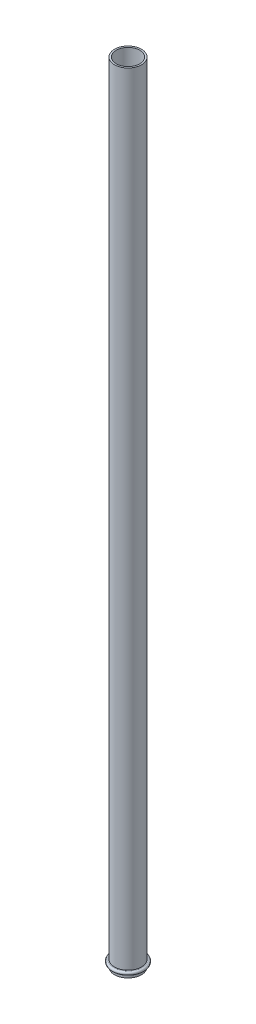
ISO-10303-21;
HEADER;
FILE_DESCRIPTION(('STEP AP214'),'2;1');
FILE_NAME('part.step','',(''),(''),'','','');
FILE_SCHEMA(('AUTOMOTIVE_DESIGN { 1 0 10303 214 1 1 1 1 }'));
ENDSEC;
DATA;
#1=APPLICATION_CONTEXT('core data for automotive mechanical design processes');
#2=APPLICATION_PROTOCOL_DEFINITION('international standard','automotive_design',2000,#1);
#3=PRODUCT_CONTEXT('',#1,'mechanical');
#4=PRODUCT('Part','Part','',(#3));
#5=PRODUCT_RELATED_PRODUCT_CATEGORY('part','',(#4));
#6=PRODUCT_DEFINITION_FORMATION('','',#4);
#7=PRODUCT_DEFINITION_CONTEXT('part definition',#1,'design');
#8=PRODUCT_DEFINITION('design','',#6,#7);
#9=PRODUCT_DEFINITION_SHAPE('','',#8);
#10=(LENGTH_UNIT() NAMED_UNIT(*) SI_UNIT(.MILLI.,.METRE.));
#11=(NAMED_UNIT(*) PLANE_ANGLE_UNIT() SI_UNIT($,.RADIAN.));
#12=(NAMED_UNIT(*) SI_UNIT($,.STERADIAN.) SOLID_ANGLE_UNIT());
#13=UNCERTAINTY_MEASURE_WITH_UNIT(LENGTH_MEASURE(1.E-05),#10,'distance_accuracy_value','');
#14=(GEOMETRIC_REPRESENTATION_CONTEXT(3) GLOBAL_UNCERTAINTY_ASSIGNED_CONTEXT((#13)) GLOBAL_UNIT_ASSIGNED_CONTEXT((#10,
#11,#12)) REPRESENTATION_CONTEXT('',''));
#15=CARTESIAN_POINT('',(0.,0.,0.));
#16=DIRECTION('',(0.,0.,1.));
#17=DIRECTION('',(1.,0.,0.));
#18=AXIS2_PLACEMENT_3D('',#15,#16,#17);
#19=CARTESIAN_POINT('',(0.,434.047675718833,0.));
#20=DIRECTION('',(0.,-1.,0.));
#21=DIRECTION('',(0.,0.,-1.));
#22=AXIS2_PLACEMENT_3D('',#19,#20,#21);
#23=CYLINDRICAL_SURFACE('',#22,6.85714285714286);
#24=CARTESIAN_POINT('',(0.,34.9105328616899,0.));
#25=DIRECTION('',(0.,-1.,0.));
#26=DIRECTION('',(0.,0.,-1.));
#27=AXIS2_PLACEMENT_3D('',#24,#25,#26);
#28=CIRCLE('',#27,6.85714285714286);
#29=CARTESIAN_POINT('',(0.,34.9105328616899,-6.85714285714287));
#30=VERTEX_POINT('',#29);
#31=EDGE_CURVE('E64',#30,#30,#28,.T.);
#32=ORIENTED_EDGE('',*,*,#31,.T.);
#33=EDGE_LOOP('',(#32));
#34=FACE_BOUND('',#33,.T.);
#35=CARTESIAN_POINT('',(0.,33.1962471474042,0.));
#36=DIRECTION('',(0.,1.,0.));
#37=DIRECTION('',(0.,0.,1.));
#38=AXIS2_PLACEMENT_3D('',#35,#36,#37);
#39=CIRCLE('',#38,6.85714285714286);
#40=CARTESIAN_POINT('',(0.,33.1962471474042,6.85714285714285));
#41=VERTEX_POINT('',#40);
#42=EDGE_CURVE('E52',#41,#41,#39,.T.);
#43=ORIENTED_EDGE('',*,*,#42,.T.);
#44=EDGE_LOOP('',(#43));
#45=FACE_BOUND('',#44,.T.);
#46=ADVANCED_FACE('F48',(#34,#45),#23,.T.);
#47=CARTESIAN_POINT('',(0.,434.047675718833,0.));
#48=DIRECTION('',(0.,1.,0.));
#49=DIRECTION('',(0.,0.,1.));
#50=AXIS2_PLACEMENT_3D('',#47,#48,#49);
#51=PLANE('',#50);
#52=CARTESIAN_POINT('',(0.,434.047675718833,0.));
#53=DIRECTION('',(0.,1.,0.));
#54=DIRECTION('',(0.,0.,1.));
#55=AXIS2_PLACEMENT_3D('',#52,#53,#54);
#56=CIRCLE('',#55,6.85714285714286);
#57=CARTESIAN_POINT('',(0.,434.047675718833,6.85714285714276));
#58=VERTEX_POINT('',#57);
#59=EDGE_CURVE('E12',#58,#58,#56,.T.);
#60=ORIENTED_EDGE('',*,*,#59,.T.);
#61=EDGE_LOOP('',(#60));
#62=FACE_BOUND('',#61,.T.);
#63=CARTESIAN_POINT('',(0.,434.047675718833,0.));
#64=DIRECTION('',(0.,1.,0.));
#65=DIRECTION('',(0.,0.,1.));
#66=AXIS2_PLACEMENT_3D('',#63,#64,#65);
#67=CIRCLE('',#66,6.);
#68=CARTESIAN_POINT('',(0.,434.047675718833,5.99999999999991));
#69=VERTEX_POINT('',#68);
#70=EDGE_CURVE('E59',#69,#69,#67,.T.);
#71=ORIENTED_EDGE('',*,*,#70,.F.);
#72=EDGE_LOOP('',(#71));
#73=FACE_BOUND('',#72,.T.);
#74=ADVANCED_FACE('F93',(#62,#73),#51,.T.);
#75=CARTESIAN_POINT('',(0.,33.1962471474042,0.));
#76=DIRECTION('',(0.,1.,0.));
#77=DIRECTION('',(0.,0.,1.));
#78=AXIS2_PLACEMENT_3D('',#75,#76,#77);
#79=PLANE('',#78);
#80=ORIENTED_EDGE('',*,*,#42,.F.);
#81=EDGE_LOOP('',(#80));
#82=FACE_BOUND('',#81,.T.);
#83=CARTESIAN_POINT('',(0.,33.1962471474042,0.));
#84=DIRECTION('',(0.,1.,0.));
#85=DIRECTION('',(0.,0.,1.));
#86=AXIS2_PLACEMENT_3D('',#83,#84,#85);
#87=CIRCLE('',#86,6.);
#88=CARTESIAN_POINT('',(0.,33.1962471474042,5.99999999999999));
#89=VERTEX_POINT('',#88);
#90=EDGE_CURVE('E61',#89,#89,#87,.T.);
#91=ORIENTED_EDGE('',*,*,#90,.T.);
#92=EDGE_LOOP('',(#91));
#93=FACE_BOUND('',#92,.T.);
#94=ADVANCED_FACE('F85',(#82,#93),#79,.F.);
#95=CARTESIAN_POINT('',(0.,36.6248185759756,0.));
#96=DIRECTION('',(0.,-1.,0.));
#97=DIRECTION('',(0.,0.,-1.));
#98=AXIS2_PLACEMENT_3D('',#95,#96,#97);
#99=CIRCLE('',#98,6.85714285714286);
#100=CARTESIAN_POINT('',(0.,36.6248185759756,-6.85714285714287));
#101=VERTEX_POINT('',#100);
#102=EDGE_CURVE('E75',#101,#101,#99,.T.);
#103=ORIENTED_EDGE('',*,*,#102,.F.);
#104=EDGE_LOOP('',(#103));
#105=FACE_BOUND('',#104,.T.);
#106=ORIENTED_EDGE('',*,*,#59,.F.);
#107=EDGE_LOOP('',(#106));
#108=FACE_BOUND('',#107,.T.);
#109=ADVANCED_FACE('F50',(#105,#108),#23,.T.);
#110=CARTESIAN_POINT('',(0.,434.047675718833,0.));
#111=DIRECTION('',(0.,-1.,0.));
#112=DIRECTION('',(0.,0.,-1.));
#113=AXIS2_PLACEMENT_3D('',#110,#111,#112);
#114=CYLINDRICAL_SURFACE('',#113,6.);
#115=ORIENTED_EDGE('',*,*,#70,.T.);
#116=EDGE_LOOP('',(#115));
#117=FACE_BOUND('',#116,.T.);
#118=ORIENTED_EDGE('',*,*,#90,.F.);
#119=EDGE_LOOP('',(#118));
#120=FACE_BOUND('',#119,.T.);
#121=ADVANCED_FACE('F84',(#117,#120),#114,.F.);
#122=CARTESIAN_POINT('',(6.85714285714285,34.9105328616899,0.));
#123=DIRECTION('',(0.,-1.,0.));
#124=DIRECTION('',(0.,0.,-1.));
#125=AXIS2_PLACEMENT_3D('',#122,#123,#124);
#126=PLANE('',#125);
#127=CARTESIAN_POINT('',(0.,34.9105328616899,0.));
#128=DIRECTION('',(0.,-1.,0.));
#129=DIRECTION('',(0.,0.,-1.));
#130=AXIS2_PLACEMENT_3D('',#127,#128,#129);
#131=CIRCLE('',#130,7.28571428571429);
#132=CARTESIAN_POINT('',(0.,34.9105328616899,-7.2857142857143));
#133=VERTEX_POINT('',#132);
#134=EDGE_CURVE('E69',#133,#133,#131,.T.);
#135=ORIENTED_EDGE('',*,*,#134,.T.);
#136=EDGE_LOOP('',(#135));
#137=FACE_BOUND('',#136,.T.);
#138=ORIENTED_EDGE('',*,*,#31,.F.);
#139=EDGE_LOOP('',(#138));
#140=FACE_BOUND('',#139,.T.);
#141=ADVANCED_FACE('F90',(#137,#140),#126,.T.);
#142=CARTESIAN_POINT('',(0.,35.7676757188327,0.));
#143=DIRECTION('',(0.,-1.,0.));
#144=DIRECTION('',(0.,0.,-1.));
#145=AXIS2_PLACEMENT_3D('',#142,#143,#144);
#146=TOROIDAL_SURFACE('',#145,7.28571428571429,0.857142857142857);
#147=CARTESIAN_POINT('',(0.,36.6248185759756,0.));
#148=DIRECTION('',(0.,-1.,0.));
#149=DIRECTION('',(0.,0.,-1.));
#150=AXIS2_PLACEMENT_3D('',#147,#148,#149);
#151=CIRCLE('',#150,7.28571428571429);
#152=CARTESIAN_POINT('',(0.,36.6248185759756,-7.2857142857143));
#153=VERTEX_POINT('',#152);
#154=EDGE_CURVE('E72',#153,#153,#151,.T.);
#155=ORIENTED_EDGE('',*,*,#154,.T.);
#156=EDGE_LOOP('',(#155));
#157=FACE_BOUND('',#156,.T.);
#158=ORIENTED_EDGE('',*,*,#134,.F.);
#159=EDGE_LOOP('',(#158));
#160=FACE_BOUND('',#159,.T.);
#161=ADVANCED_FACE('F109',(#157,#160),#146,.T.);
#162=CARTESIAN_POINT('',(7.2857142857143,36.6248185759756,0.));
#163=DIRECTION('',(0.,1.,0.));
#164=DIRECTION('',(0.,0.,1.));
#165=AXIS2_PLACEMENT_3D('',#162,#163,#164);
#166=PLANE('',#165);
#167=ORIENTED_EDGE('',*,*,#102,.T.);
#168=EDGE_LOOP('',(#167));
#169=FACE_BOUND('',#168,.T.);
#170=ORIENTED_EDGE('',*,*,#154,.F.);
#171=EDGE_LOOP('',(#170));
#172=FACE_BOUND('',#171,.T.);
#173=ADVANCED_FACE('F79',(#169,#172),#166,.T.);
#174=CLOSED_SHELL('',(#46,#74,#94,#109,#121,#141,#161,#173));
#175=MANIFOLD_SOLID_BREP('B2',#174);
#176=ADVANCED_BREP_SHAPE_REPRESENTATION('',(#18,#175),#14);
#177=SHAPE_DEFINITION_REPRESENTATION(#9,#176);
ENDSEC;
END-ISO-10303-21;
